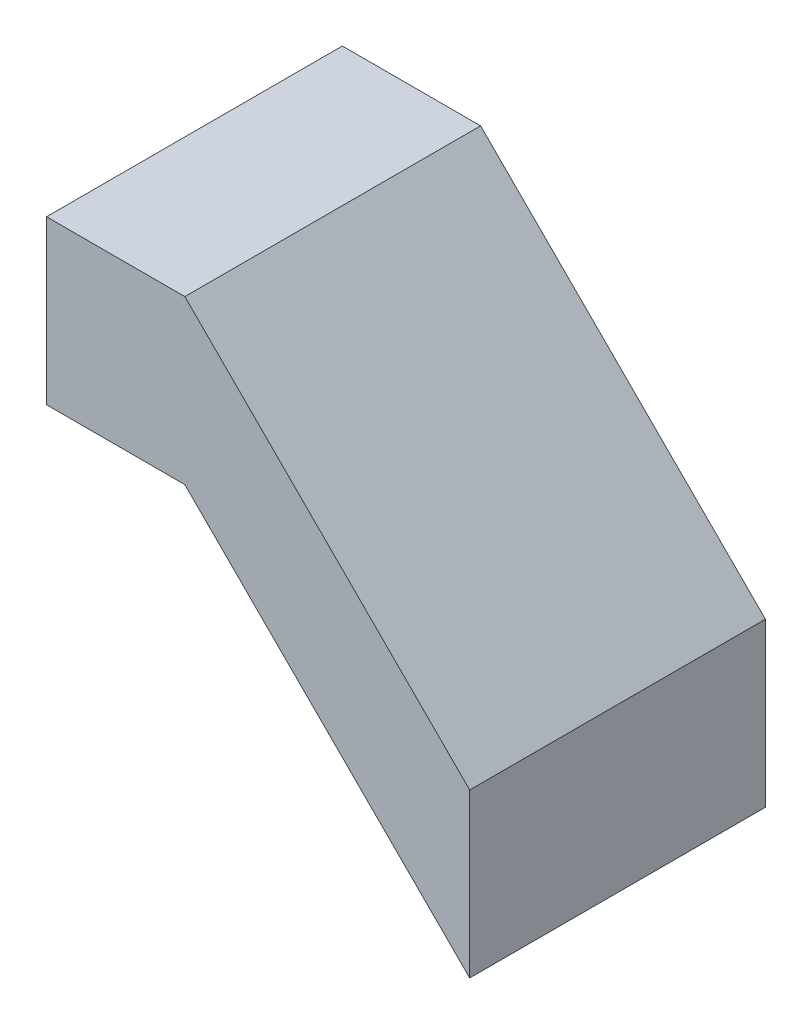
ISO-10303-21;
HEADER;
FILE_DESCRIPTION(('STEP AP214'),'2;1');
FILE_NAME('part.step','',(''),(''),'','','');
FILE_SCHEMA(('AUTOMOTIVE_DESIGN { 1 0 10303 214 1 1 1 1 }'));
ENDSEC;
DATA;
#1=APPLICATION_CONTEXT('core data for automotive mechanical design processes');
#2=APPLICATION_PROTOCOL_DEFINITION('international standard','automotive_design',2000,#1);
#3=PRODUCT_CONTEXT('',#1,'mechanical');
#4=PRODUCT('Part','Part','',(#3));
#5=PRODUCT_RELATED_PRODUCT_CATEGORY('part','',(#4));
#6=PRODUCT_DEFINITION_FORMATION('','',#4);
#7=PRODUCT_DEFINITION_CONTEXT('part definition',#1,'design');
#8=PRODUCT_DEFINITION('design','',#6,#7);
#9=PRODUCT_DEFINITION_SHAPE('','',#8);
#10=(LENGTH_UNIT() NAMED_UNIT(*) SI_UNIT(.MILLI.,.METRE.));
#11=(NAMED_UNIT(*) PLANE_ANGLE_UNIT() SI_UNIT($,.RADIAN.));
#12=(NAMED_UNIT(*) SI_UNIT($,.STERADIAN.) SOLID_ANGLE_UNIT());
#13=UNCERTAINTY_MEASURE_WITH_UNIT(LENGTH_MEASURE(1.E-05),#10,'distance_accuracy_value','');
#14=(GEOMETRIC_REPRESENTATION_CONTEXT(3) GLOBAL_UNCERTAINTY_ASSIGNED_CONTEXT((#13)) GLOBAL_UNIT_ASSIGNED_CONTEXT((#10,
#11,#12)) REPRESENTATION_CONTEXT('',''));
#15=CARTESIAN_POINT('',(0.,0.,0.));
#16=DIRECTION('',(0.,0.,1.));
#17=DIRECTION('',(1.,0.,0.));
#18=AXIS2_PLACEMENT_3D('',#15,#16,#17);
#19=CARTESIAN_POINT('',(193.75453947,-55.999935,-9.08));
#20=DIRECTION('',(0.,-1.,0.));
#21=DIRECTION('',(0.,0.,-1.));
#22=AXIS2_PLACEMENT_3D('',#19,#20,#21);
#23=PLANE('',#22);
#24=DIRECTION('',(1.,0.,0.));
#25=VECTOR('',#24,1.);
#26=CARTESIAN_POINT('',(193.75453947,-55.999935,0.));
#27=LINE('',#26,#25);
#28=CARTESIAN_POINT('',(193.75453947,-55.999935,0.));
#29=VERTEX_POINT('',#28);
#30=CARTESIAN_POINT('',(197.99984,-55.999935,0.));
#31=VERTEX_POINT('',#30);
#32=EDGE_CURVE('E140',#29,#31,#27,.T.);
#33=ORIENTED_EDGE('',*,*,#32,.F.);
#34=DIRECTION('',(0.,0.,1.));
#35=VECTOR('',#34,1.);
#36=CARTESIAN_POINT('',(193.75453947,-55.999935,-9.08));
#37=LINE('',#36,#35);
#38=CARTESIAN_POINT('',(193.75453947,-55.999935,-9.08));
#39=VERTEX_POINT('',#38);
#40=EDGE_CURVE('E11',#39,#29,#37,.T.);
#41=ORIENTED_EDGE('',*,*,#40,.F.);
#42=DIRECTION('',(1.,0.,0.));
#43=VECTOR('',#42,1.);
#44=CARTESIAN_POINT('',(193.75453947,-55.999935,-9.08));
#45=LINE('',#44,#43);
#46=CARTESIAN_POINT('',(197.99984,-55.999935,-9.08));
#47=VERTEX_POINT('',#46);
#48=EDGE_CURVE('E141',#39,#47,#45,.T.);
#49=ORIENTED_EDGE('',*,*,#48,.T.);
#50=DIRECTION('',(0.,0.,1.));
#51=VECTOR('',#50,1.);
#52=CARTESIAN_POINT('',(197.99984,-55.999935,-9.08));
#53=LINE('',#52,#51);
#54=EDGE_CURVE('E36',#47,#31,#53,.T.);
#55=ORIENTED_EDGE('',*,*,#54,.T.);
#56=EDGE_LOOP('',(#33,#41,#49,#55));
#57=FACE_BOUND('',#56,.T.);
#58=ADVANCED_FACE('F33',(#57),#23,.T.);
#59=CARTESIAN_POINT('',(193.75453947,-55.999935,-9.08));
#60=DIRECTION('',(-1.,0.,0.));
#61=DIRECTION('',(0.,0.,1.));
#62=AXIS2_PLACEMENT_3D('',#59,#60,#61);
#63=PLANE('',#62);
#64=DIRECTION('',(0.,-1.,0.));
#65=VECTOR('',#64,1.);
#66=CARTESIAN_POINT('',(193.75453947,-55.999935,0.));
#67=LINE('',#66,#65);
#68=CARTESIAN_POINT('',(193.75453947,-50.999935,0.));
#69=VERTEX_POINT('',#68);
#70=EDGE_CURVE('E145',#69,#29,#67,.T.);
#71=ORIENTED_EDGE('',*,*,#70,.F.);
#72=DIRECTION('',(0.,0.,1.));
#73=VECTOR('',#72,1.);
#74=CARTESIAN_POINT('',(193.75453947,-50.999935,-9.08));
#75=LINE('',#74,#73);
#76=CARTESIAN_POINT('',(193.75453947,-50.999935,-9.08));
#77=VERTEX_POINT('',#76);
#78=EDGE_CURVE('E41',#77,#69,#75,.T.);
#79=ORIENTED_EDGE('',*,*,#78,.F.);
#80=DIRECTION('',(0.,-1.,0.));
#81=VECTOR('',#80,1.);
#82=CARTESIAN_POINT('',(193.75453947,-55.999935,-9.08));
#83=LINE('',#82,#81);
#84=EDGE_CURVE('E156',#77,#39,#83,.T.);
#85=ORIENTED_EDGE('',*,*,#84,.T.);
#86=ORIENTED_EDGE('',*,*,#40,.T.);
#87=EDGE_LOOP('',(#71,#79,#85,#86));
#88=FACE_BOUND('',#87,.T.);
#89=ADVANCED_FACE('F193',(#88),#63,.T.);
#90=CARTESIAN_POINT('',(193.75453947,-50.999935,-9.08));
#91=DIRECTION('',(0.,1.,0.));
#92=DIRECTION('',(0.,0.,1.));
#93=AXIS2_PLACEMENT_3D('',#90,#91,#92);
#94=PLANE('',#93);
#95=DIRECTION('',(-1.,0.,0.));
#96=VECTOR('',#95,1.);
#97=CARTESIAN_POINT('',(193.75453947,-50.999935,0.));
#98=LINE('',#97,#96);
#99=CARTESIAN_POINT('',(197.99984,-50.999935,0.));
#100=VERTEX_POINT('',#99);
#101=EDGE_CURVE('E170',#100,#69,#98,.T.);
#102=ORIENTED_EDGE('',*,*,#101,.F.);
#103=DIRECTION('',(0.,0.,1.));
#104=VECTOR('',#103,1.);
#105=CARTESIAN_POINT('',(197.99984,-50.999935,-9.08));
#106=LINE('',#105,#104);
#107=CARTESIAN_POINT('',(197.99984,-50.999935,-9.08));
#108=VERTEX_POINT('',#107);
#109=EDGE_CURVE('E176',#108,#100,#106,.T.);
#110=ORIENTED_EDGE('',*,*,#109,.F.);
#111=DIRECTION('',(-1.,0.,0.));
#112=VECTOR('',#111,1.);
#113=CARTESIAN_POINT('',(193.75453947,-50.999935,-9.08));
#114=LINE('',#113,#112);
#115=EDGE_CURVE('E153',#108,#77,#114,.T.);
#116=ORIENTED_EDGE('',*,*,#115,.T.);
#117=ORIENTED_EDGE('',*,*,#78,.T.);
#118=EDGE_LOOP('',(#102,#110,#116,#117));
#119=FACE_BOUND('',#118,.T.);
#120=ADVANCED_FACE('F208',(#119),#94,.T.);
#121=CARTESIAN_POINT('',(197.99984,-50.999935,-9.08));
#122=DIRECTION('',(0.707106781186547,0.707106781186547,0.));
#123=DIRECTION('',(-0.707106781186548,0.707106781186548,0.));
#124=AXIS2_PLACEMENT_3D('',#121,#122,#123);
#125=PLANE('',#124);
#126=DIRECTION('',(-0.707106781186547,0.707106781186547,0.));
#127=VECTOR('',#126,1.);
#128=CARTESIAN_POINT('',(197.99984,-50.999935,0.));
#129=LINE('',#128,#127);
#130=CARTESIAN_POINT('',(206.745140529998,-59.7452355299983,0.));
#131=VERTEX_POINT('',#130);
#132=EDGE_CURVE('E167',#131,#100,#129,.T.);
#133=ORIENTED_EDGE('',*,*,#132,.F.);
#134=DIRECTION('',(0.,0.,1.));
#135=VECTOR('',#134,1.);
#136=CARTESIAN_POINT('',(206.745140529998,-59.7452355299983,-9.08));
#137=LINE('',#136,#135);
#138=CARTESIAN_POINT('',(206.745140529998,-59.7452355299983,-9.08));
#139=VERTEX_POINT('',#138);
#140=EDGE_CURVE('E178',#139,#131,#137,.T.);
#141=ORIENTED_EDGE('',*,*,#140,.F.);
#142=DIRECTION('',(-0.707106781186547,0.707106781186547,0.));
#143=VECTOR('',#142,1.);
#144=CARTESIAN_POINT('',(197.99984,-50.999935,-9.08));
#145=LINE('',#144,#143);
#146=EDGE_CURVE('E150',#139,#108,#145,.T.);
#147=ORIENTED_EDGE('',*,*,#146,.T.);
#148=ORIENTED_EDGE('',*,*,#109,.T.);
#149=EDGE_LOOP('',(#133,#141,#147,#148));
#150=FACE_BOUND('',#149,.T.);
#151=ADVANCED_FACE('F206',(#150),#125,.T.);
#152=CARTESIAN_POINT('',(206.745140529998,-64.7452355299983,-9.08));
#153=DIRECTION('',(1.,0.,0.));
#154=DIRECTION('',(0.,0.,-1.));
#155=AXIS2_PLACEMENT_3D('',#152,#153,#154);
#156=PLANE('',#155);
#157=DIRECTION('',(0.,1.,0.));
#158=VECTOR('',#157,1.);
#159=CARTESIAN_POINT('',(206.745140529998,-64.7452355299983,0.));
#160=LINE('',#159,#158);
#161=CARTESIAN_POINT('',(206.745140529998,-64.7452355299983,0.));
#162=VERTEX_POINT('',#161);
#163=EDGE_CURVE('E164',#162,#131,#160,.T.);
#164=ORIENTED_EDGE('',*,*,#163,.F.);
#165=DIRECTION('',(0.,0.,1.));
#166=VECTOR('',#165,1.);
#167=CARTESIAN_POINT('',(206.745140529998,-64.7452355299983,-9.08));
#168=LINE('',#167,#166);
#169=CARTESIAN_POINT('',(206.745140529998,-64.7452355299983,-9.08));
#170=VERTEX_POINT('',#169);
#171=EDGE_CURVE('E117',#170,#162,#168,.T.);
#172=ORIENTED_EDGE('',*,*,#171,.F.);
#173=DIRECTION('',(0.,1.,0.));
#174=VECTOR('',#173,1.);
#175=CARTESIAN_POINT('',(206.745140529998,-64.7452355299983,-9.08));
#176=LINE('',#175,#174);
#177=EDGE_CURVE('E147',#170,#139,#176,.T.);
#178=ORIENTED_EDGE('',*,*,#177,.T.);
#179=ORIENTED_EDGE('',*,*,#140,.T.);
#180=EDGE_LOOP('',(#164,#172,#178,#179));
#181=FACE_BOUND('',#180,.T.);
#182=ADVANCED_FACE('F203',(#181),#156,.T.);
#183=CARTESIAN_POINT('',(204.745140530002,-62.7452355300017,-9.08));
#184=DIRECTION('',(-0.707106781186547,-0.707106781186547,0.));
#185=DIRECTION('',(0.707106781186548,-0.707106781186548,0.));
#186=AXIS2_PLACEMENT_3D('',#183,#184,#185);
#187=PLANE('',#186);
#188=DIRECTION('',(0.,0.,1.));
#189=VECTOR('',#188,1.);
#190=CARTESIAN_POINT('',(204.745140530002,-62.7452355300017,-9.08));
#191=LINE('',#190,#189);
#192=CARTESIAN_POINT('',(204.745140530002,-62.7452355300017,-5.));
#193=VERTEX_POINT('',#192);
#194=CARTESIAN_POINT('',(204.745140530002,-62.7452355300017,-1.5));
#195=VERTEX_POINT('',#194);
#196=EDGE_CURVE('E109',#193,#195,#191,.T.);
#197=ORIENTED_EDGE('',*,*,#196,.F.);
#198=DIRECTION('',(-0.707106781186547,0.707106781186547,0.));
#199=VECTOR('',#198,1.);
#200=CARTESIAN_POINT('',(200.745140530002,-58.7452355300017,-5.));
#201=LINE('',#200,#199);
#202=CARTESIAN_POINT('',(200.745140530002,-58.7452355300017,-5.));
#203=VERTEX_POINT('',#202);
#204=EDGE_CURVE('E319',#193,#203,#201,.T.);
#205=ORIENTED_EDGE('',*,*,#204,.T.);
#206=DIRECTION('',(0.,0.,1.));
#207=VECTOR('',#206,1.);
#208=CARTESIAN_POINT('',(200.745140530002,-58.7452355300017,-9.08));
#209=LINE('',#208,#207);
#210=CARTESIAN_POINT('',(200.745140530002,-58.7452355300017,-1.5));
#211=VERTEX_POINT('',#210);
#212=EDGE_CURVE('E132',#203,#211,#209,.T.);
#213=ORIENTED_EDGE('',*,*,#212,.T.);
#214=DIRECTION('',(0.707106781186547,-0.707106781186547,0.));
#215=VECTOR('',#214,1.);
#216=CARTESIAN_POINT('',(204.745140530002,-62.7452355300017,-1.5));
#217=LINE('',#216,#215);
#218=EDGE_CURVE('E125',#211,#195,#217,.T.);
#219=ORIENTED_EDGE('',*,*,#218,.T.);
#220=EDGE_LOOP('',(#197,#205,#213,#219));
#221=FACE_BOUND('',#220,.T.);
#222=DIRECTION('',(0.707106781186547,-0.707106781186547,0.));
#223=VECTOR('',#222,1.);
#224=CARTESIAN_POINT('',(204.745140530002,-62.7452355300017,0.));
#225=LINE('',#224,#223);
#226=EDGE_CURVE('E161',#31,#162,#225,.T.);
#227=ORIENTED_EDGE('',*,*,#226,.F.);
#228=ORIENTED_EDGE('',*,*,#54,.F.);
#229=DIRECTION('',(0.707106781186547,-0.707106781186547,0.));
#230=VECTOR('',#229,1.);
#231=CARTESIAN_POINT('',(200.745140530002,-58.7452355300017,-9.08));
#232=LINE('',#231,#230);
#233=EDGE_CURVE('E144',#47,#170,#232,.T.);
#234=ORIENTED_EDGE('',*,*,#233,.T.);
#235=ORIENTED_EDGE('',*,*,#171,.T.);
#236=EDGE_LOOP('',(#227,#228,#234,#235));
#237=FACE_BOUND('',#236,.T.);
#238=ADVANCED_FACE('F130',(#221,#237),#187,.T.);
#239=CARTESIAN_POINT('',(204.745140530002,-62.7452355300017,-9.08));
#240=DIRECTION('',(-1.,0.,0.));
#241=DIRECTION('',(0.,0.,1.));
#242=AXIS2_PLACEMENT_3D('',#239,#240,#241);
#243=PLANE('',#242);
#244=DIRECTION('',(0.,-1.,0.));
#245=VECTOR('',#244,1.);
#246=CARTESIAN_POINT('',(204.745140530002,-62.7452355300017,-5.));
#247=LINE('',#246,#245);
#248=CARTESIAN_POINT('',(204.745140530002,-60.2452355300017,-5.));
#249=VERTEX_POINT('',#248);
#250=EDGE_CURVE('E49',#249,#193,#247,.T.);
#251=ORIENTED_EDGE('',*,*,#250,.T.);
#252=ORIENTED_EDGE('',*,*,#196,.T.);
#253=DIRECTION('',(0.,1.,0.));
#254=VECTOR('',#253,1.);
#255=CARTESIAN_POINT('',(204.745140530002,-60.2452355300017,-1.5));
#256=LINE('',#255,#254);
#257=CARTESIAN_POINT('',(204.745140530002,-60.2452355300017,-1.5));
#258=VERTEX_POINT('',#257);
#259=EDGE_CURVE('E112',#195,#258,#256,.T.);
#260=ORIENTED_EDGE('',*,*,#259,.T.);
#261=DIRECTION('',(0.,0.,1.));
#262=VECTOR('',#261,1.);
#263=CARTESIAN_POINT('',(204.745140530002,-60.2452355300017,-9.08));
#264=LINE('',#263,#262);
#265=EDGE_CURVE('E118',#249,#258,#264,.T.);
#266=ORIENTED_EDGE('',*,*,#265,.F.);
#267=EDGE_LOOP('',(#251,#252,#260,#266));
#268=FACE_BOUND('',#267,.T.);
#269=ADVANCED_FACE('F111',(#268),#243,.T.);
#270=CARTESIAN_POINT('',(200.745140530002,-56.2452355300017,-9.08));
#271=DIRECTION('',(-0.707106781186547,-0.707106781186547,0.));
#272=DIRECTION('',(0.707106781186548,-0.707106781186548,0.));
#273=AXIS2_PLACEMENT_3D('',#270,#271,#272);
#274=PLANE('',#273);
#275=DIRECTION('',(0.707106781186547,-0.707106781186547,0.));
#276=VECTOR('',#275,1.);
#277=CARTESIAN_POINT('',(204.745140530002,-60.2452355300017,-5.));
#278=LINE('',#277,#276);
#279=CARTESIAN_POINT('',(200.745140530002,-56.2452355300017,-5.));
#280=VERTEX_POINT('',#279);
#281=EDGE_CURVE('E57',#280,#249,#278,.T.);
#282=ORIENTED_EDGE('',*,*,#281,.T.);
#283=ORIENTED_EDGE('',*,*,#265,.T.);
#284=DIRECTION('',(-0.707106781186547,0.707106781186547,0.));
#285=VECTOR('',#284,1.);
#286=CARTESIAN_POINT('',(200.745140530002,-56.2452355300017,-1.5));
#287=LINE('',#286,#285);
#288=CARTESIAN_POINT('',(200.745140530002,-56.2452355300017,-1.5));
#289=VERTEX_POINT('',#288);
#290=EDGE_CURVE('E128',#258,#289,#287,.T.);
#291=ORIENTED_EDGE('',*,*,#290,.T.);
#292=DIRECTION('',(0.,0.,1.));
#293=VECTOR('',#292,1.);
#294=CARTESIAN_POINT('',(200.745140530002,-56.2452355300017,-9.08));
#295=LINE('',#294,#293);
#296=EDGE_CURVE('E182',#280,#289,#295,.T.);
#297=ORIENTED_EDGE('',*,*,#296,.F.);
#298=EDGE_LOOP('',(#282,#283,#291,#297));
#299=FACE_BOUND('',#298,.T.);
#300=ADVANCED_FACE('F282',(#299),#274,.T.);
#301=CARTESIAN_POINT('',(200.745140530002,-58.7452355300017,-9.08));
#302=DIRECTION('',(1.,0.,0.));
#303=DIRECTION('',(0.,0.,-1.));
#304=AXIS2_PLACEMENT_3D('',#301,#302,#303);
#305=PLANE('',#304);
#306=DIRECTION('',(0.,1.,0.));
#307=VECTOR('',#306,1.);
#308=CARTESIAN_POINT('',(200.745140530002,-56.2452355300017,-5.));
#309=LINE('',#308,#307);
#310=EDGE_CURVE('E320',#203,#280,#309,.T.);
#311=ORIENTED_EDGE('',*,*,#310,.T.);
#312=ORIENTED_EDGE('',*,*,#296,.T.);
#313=DIRECTION('',(0.,-1.,0.));
#314=VECTOR('',#313,1.);
#315=CARTESIAN_POINT('',(200.745140530002,-58.7452355300017,-1.5));
#316=LINE('',#315,#314);
#317=EDGE_CURVE('E138',#289,#211,#316,.T.);
#318=ORIENTED_EDGE('',*,*,#317,.T.);
#319=ORIENTED_EDGE('',*,*,#212,.F.);
#320=EDGE_LOOP('',(#311,#312,#318,#319));
#321=FACE_BOUND('',#320,.T.);
#322=ADVANCED_FACE('F291',(#321),#305,.T.);
#323=CARTESIAN_POINT('',(0.,0.,-9.08));
#324=DIRECTION('',(0.,0.,1.));
#325=DIRECTION('',(1.,0.,0.));
#326=AXIS2_PLACEMENT_3D('',#323,#324,#325);
#327=PLANE('',#326);
#328=ORIENTED_EDGE('',*,*,#177,.F.);
#329=ORIENTED_EDGE('',*,*,#233,.F.);
#330=ORIENTED_EDGE('',*,*,#48,.F.);
#331=ORIENTED_EDGE('',*,*,#84,.F.);
#332=ORIENTED_EDGE('',*,*,#115,.F.);
#333=ORIENTED_EDGE('',*,*,#146,.F.);
#334=EDGE_LOOP('',(#328,#329,#330,#331,#332,#333));
#335=FACE_BOUND('',#334,.T.);
#336=ADVANCED_FACE('F197',(#335),#327,.F.);
#337=CARTESIAN_POINT('',(0.,0.,0.));
#338=DIRECTION('',(0.,0.,1.));
#339=DIRECTION('',(1.,0.,0.));
#340=AXIS2_PLACEMENT_3D('',#337,#338,#339);
#341=PLANE('',#340);
#342=ORIENTED_EDGE('',*,*,#32,.T.);
#343=ORIENTED_EDGE('',*,*,#226,.T.);
#344=ORIENTED_EDGE('',*,*,#163,.T.);
#345=ORIENTED_EDGE('',*,*,#132,.T.);
#346=ORIENTED_EDGE('',*,*,#101,.T.);
#347=ORIENTED_EDGE('',*,*,#70,.T.);
#348=EDGE_LOOP('',(#342,#343,#344,#345,#346,#347));
#349=FACE_BOUND('',#348,.T.);
#350=ADVANCED_FACE('F189',(#349),#341,.T.);
#351=CARTESIAN_POINT('',(0.,0.,-1.5));
#352=DIRECTION('',(0.,0.,-1.));
#353=DIRECTION('',(-1.,0.,0.));
#354=AXIS2_PLACEMENT_3D('',#351,#352,#353);
#355=PLANE('',#354);
#356=ORIENTED_EDGE('',*,*,#218,.F.);
#357=ORIENTED_EDGE('',*,*,#317,.F.);
#358=ORIENTED_EDGE('',*,*,#290,.F.);
#359=ORIENTED_EDGE('',*,*,#259,.F.);
#360=EDGE_LOOP('',(#356,#357,#358,#359));
#361=FACE_BOUND('',#360,.T.);
#362=ADVANCED_FACE('F123',(#361),#355,.T.);
#363=CARTESIAN_POINT('',(0.,0.,-5.));
#364=DIRECTION('',(0.,0.,1.));
#365=DIRECTION('',(1.,0.,0.));
#366=AXIS2_PLACEMENT_3D('',#363,#364,#365);
#367=PLANE('',#366);
#368=ORIENTED_EDGE('',*,*,#204,.F.);
#369=ORIENTED_EDGE('',*,*,#250,.F.);
#370=ORIENTED_EDGE('',*,*,#281,.F.);
#371=ORIENTED_EDGE('',*,*,#310,.F.);
#372=EDGE_LOOP('',(#368,#369,#370,#371));
#373=FACE_BOUND('',#372,.T.);
#374=ADVANCED_FACE('F264',(#373),#367,.T.);
#375=CLOSED_SHELL('',(#58,#89,#120,#151,#182,#238,#269,#300,#322,#336,#350,#362,#374));
#376=MANIFOLD_SOLID_BREP('B2',#375);
#377=ADVANCED_BREP_SHAPE_REPRESENTATION('',(#18,#376),#14);
#378=SHAPE_DEFINITION_REPRESENTATION(#9,#377);
ENDSEC;
END-ISO-10303-21;
